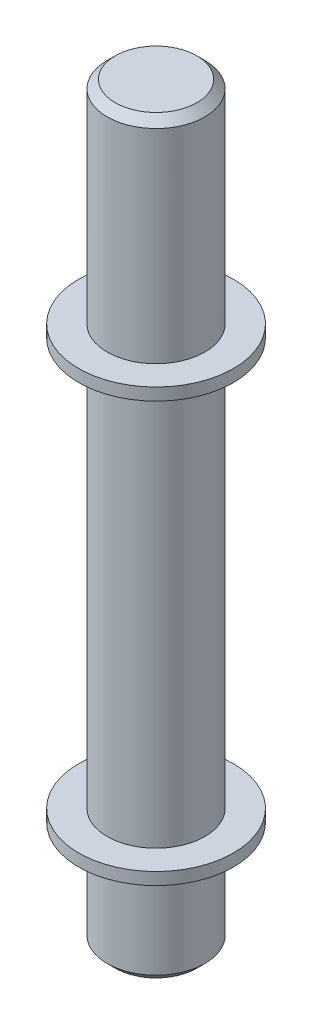
ISO-10303-21;
HEADER;
FILE_DESCRIPTION(('STEP AP214'),'2;1');
FILE_NAME('part.step','',(''),(''),'','','');
FILE_SCHEMA(('AUTOMOTIVE_DESIGN { 1 0 10303 214 1 1 1 1 }'));
ENDSEC;
DATA;
#1=APPLICATION_CONTEXT('core data for automotive mechanical design processes');
#2=APPLICATION_PROTOCOL_DEFINITION('international standard','automotive_design',2000,#1);
#3=PRODUCT_CONTEXT('',#1,'mechanical');
#4=PRODUCT('Part','Part','',(#3));
#5=PRODUCT_RELATED_PRODUCT_CATEGORY('part','',(#4));
#6=PRODUCT_DEFINITION_FORMATION('','',#4);
#7=PRODUCT_DEFINITION_CONTEXT('part definition',#1,'design');
#8=PRODUCT_DEFINITION('design','',#6,#7);
#9=PRODUCT_DEFINITION_SHAPE('','',#8);
#10=(LENGTH_UNIT() NAMED_UNIT(*) SI_UNIT(.MILLI.,.METRE.));
#11=(NAMED_UNIT(*) PLANE_ANGLE_UNIT() SI_UNIT($,.RADIAN.));
#12=(NAMED_UNIT(*) SI_UNIT($,.STERADIAN.) SOLID_ANGLE_UNIT());
#13=UNCERTAINTY_MEASURE_WITH_UNIT(LENGTH_MEASURE(1.E-05),#10,'distance_accuracy_value','');
#14=(GEOMETRIC_REPRESENTATION_CONTEXT(3) GLOBAL_UNCERTAINTY_ASSIGNED_CONTEXT((#13)) GLOBAL_UNIT_ASSIGNED_CONTEXT((#10,
#11,#12)) REPRESENTATION_CONTEXT('',''));
#15=CARTESIAN_POINT('',(0.,0.,0.));
#16=DIRECTION('',(0.,0.,1.));
#17=DIRECTION('',(1.,0.,0.));
#18=AXIS2_PLACEMENT_3D('',#15,#16,#17);
#19=CARTESIAN_POINT('',(0.,184.,0.));
#20=DIRECTION('',(0.,1.,0.));
#21=DIRECTION('',(0.,0.,1.));
#22=AXIS2_PLACEMENT_3D('',#19,#20,#21);
#23=PLANE('',#22);
#24=CARTESIAN_POINT('',(0.,184.,0.));
#25=DIRECTION('',(0.,1.,0.));
#26=DIRECTION('',(0.,0.,1.));
#27=AXIS2_PLACEMENT_3D('',#24,#25,#26);
#28=CIRCLE('',#27,10.);
#29=CARTESIAN_POINT('',(0.,184.,10.));
#30=VERTEX_POINT('',#29);
#31=EDGE_CURVE('E10',#30,#30,#28,.T.);
#32=ORIENTED_EDGE('',*,*,#31,.T.);
#33=EDGE_LOOP('',(#32));
#34=FACE_BOUND('',#33,.T.);
#35=ADVANCED_FACE('F47',(#34),#23,.T.);
#36=CARTESIAN_POINT('',(0.,0.,0.));
#37=DIRECTION('',(0.,-1.,0.));
#38=DIRECTION('',(0.,0.,-1.));
#39=AXIS2_PLACEMENT_3D('',#36,#37,#38);
#40=CYLINDRICAL_SURFACE('',#39,12.);
#41=CARTESIAN_POINT('',(0.,182.,0.));
#42=DIRECTION('',(0.,1.,0.));
#43=DIRECTION('',(0.,0.,1.));
#44=AXIS2_PLACEMENT_3D('',#41,#42,#43);
#45=CIRCLE('',#44,12.);
#46=CARTESIAN_POINT('',(0.,182.,12.));
#47=VERTEX_POINT('',#46);
#48=EDGE_CURVE('E55',#47,#47,#45,.F.);
#49=ORIENTED_EDGE('',*,*,#48,.T.);
#50=EDGE_LOOP('',(#49));
#51=FACE_BOUND('',#50,.T.);
#52=CARTESIAN_POINT('',(0.,132.,0.));
#53=DIRECTION('',(0.,-1.,0.));
#54=DIRECTION('',(0.,0.,-1.));
#55=AXIS2_PLACEMENT_3D('',#52,#53,#54);
#56=CIRCLE('',#55,12.);
#57=CARTESIAN_POINT('',(0.,132.,-12.));
#58=VERTEX_POINT('',#57);
#59=EDGE_CURVE('E68',#58,#58,#56,.T.);
#60=ORIENTED_EDGE('',*,*,#59,.F.);
#61=EDGE_LOOP('',(#60));
#62=FACE_BOUND('',#61,.T.);
#63=ADVANCED_FACE('F111',(#51,#62),#40,.T.);
#64=CARTESIAN_POINT('',(12.,132.,0.));
#65=DIRECTION('',(0.,1.,0.));
#66=DIRECTION('',(0.,0.,1.));
#67=AXIS2_PLACEMENT_3D('',#64,#65,#66);
#68=PLANE('',#67);
#69=ORIENTED_EDGE('',*,*,#59,.T.);
#70=EDGE_LOOP('',(#69));
#71=FACE_BOUND('',#70,.T.);
#72=CARTESIAN_POINT('',(0.,132.,0.));
#73=DIRECTION('',(0.,-1.,0.));
#74=DIRECTION('',(0.,0.,-1.));
#75=AXIS2_PLACEMENT_3D('',#72,#73,#74);
#76=CIRCLE('',#75,19.);
#77=CARTESIAN_POINT('',(0.,132.,-19.));
#78=VERTEX_POINT('',#77);
#79=EDGE_CURVE('E71',#78,#78,#76,.T.);
#80=ORIENTED_EDGE('',*,*,#79,.F.);
#81=EDGE_LOOP('',(#80));
#82=FACE_BOUND('',#81,.T.);
#83=ADVANCED_FACE('F116',(#71,#82),#68,.T.);
#84=CARTESIAN_POINT('',(0.,0.,0.));
#85=DIRECTION('',(0.,-1.,0.));
#86=DIRECTION('',(0.,0.,-1.));
#87=AXIS2_PLACEMENT_3D('',#84,#85,#86);
#88=CYLINDRICAL_SURFACE('',#87,19.);
#89=ORIENTED_EDGE('',*,*,#79,.T.);
#90=EDGE_LOOP('',(#89));
#91=FACE_BOUND('',#90,.T.);
#92=CARTESIAN_POINT('',(0.,129.,0.));
#93=DIRECTION('',(0.,-1.,0.));
#94=DIRECTION('',(0.,0.,-1.));
#95=AXIS2_PLACEMENT_3D('',#92,#93,#94);
#96=CIRCLE('',#95,19.);
#97=CARTESIAN_POINT('',(0.,129.,-19.));
#98=VERTEX_POINT('',#97);
#99=EDGE_CURVE('E74',#98,#98,#96,.T.);
#100=ORIENTED_EDGE('',*,*,#99,.F.);
#101=EDGE_LOOP('',(#100));
#102=FACE_BOUND('',#101,.T.);
#103=ADVANCED_FACE('F159',(#91,#102),#88,.T.);
#104=CARTESIAN_POINT('',(12.,129.,0.));
#105=DIRECTION('',(0.,-1.,0.));
#106=DIRECTION('',(0.,0.,-1.));
#107=AXIS2_PLACEMENT_3D('',#104,#105,#106);
#108=PLANE('',#107);
#109=ORIENTED_EDGE('',*,*,#99,.T.);
#110=EDGE_LOOP('',(#109));
#111=FACE_BOUND('',#110,.T.);
#112=CARTESIAN_POINT('',(0.,129.,0.));
#113=DIRECTION('',(0.,-1.,0.));
#114=DIRECTION('',(0.,0.,-1.));
#115=AXIS2_PLACEMENT_3D('',#112,#113,#114);
#116=CIRCLE('',#115,12.);
#117=CARTESIAN_POINT('',(0.,129.,-12.));
#118=VERTEX_POINT('',#117);
#119=EDGE_CURVE('E77',#118,#118,#116,.T.);
#120=ORIENTED_EDGE('',*,*,#119,.F.);
#121=EDGE_LOOP('',(#120));
#122=FACE_BOUND('',#121,.T.);
#123=ADVANCED_FACE('F166',(#111,#122),#108,.T.);
#124=CARTESIAN_POINT('',(0.,0.,0.));
#125=DIRECTION('',(0.,-1.,0.));
#126=DIRECTION('',(0.,0.,-1.));
#127=AXIS2_PLACEMENT_3D('',#124,#125,#126);
#128=CYLINDRICAL_SURFACE('',#127,12.);
#129=ORIENTED_EDGE('',*,*,#119,.T.);
#130=EDGE_LOOP('',(#129));
#131=FACE_BOUND('',#130,.T.);
#132=CARTESIAN_POINT('',(0.,29.,0.));
#133=DIRECTION('',(0.,-1.,0.));
#134=DIRECTION('',(0.,0.,-1.));
#135=AXIS2_PLACEMENT_3D('',#132,#133,#134);
#136=CIRCLE('',#135,12.);
#137=CARTESIAN_POINT('',(0.,29.,-12.));
#138=VERTEX_POINT('',#137);
#139=EDGE_CURVE('E80',#138,#138,#136,.T.);
#140=ORIENTED_EDGE('',*,*,#139,.F.);
#141=EDGE_LOOP('',(#140));
#142=FACE_BOUND('',#141,.T.);
#143=ADVANCED_FACE('F174',(#131,#142),#128,.T.);
#144=CARTESIAN_POINT('',(12.,29.,0.));
#145=DIRECTION('',(0.,1.,0.));
#146=DIRECTION('',(0.,0.,1.));
#147=AXIS2_PLACEMENT_3D('',#144,#145,#146);
#148=PLANE('',#147);
#149=ORIENTED_EDGE('',*,*,#139,.T.);
#150=EDGE_LOOP('',(#149));
#151=FACE_BOUND('',#150,.T.);
#152=CARTESIAN_POINT('',(0.,29.,0.));
#153=DIRECTION('',(0.,-1.,0.));
#154=DIRECTION('',(0.,0.,-1.));
#155=AXIS2_PLACEMENT_3D('',#152,#153,#154);
#156=CIRCLE('',#155,19.);
#157=CARTESIAN_POINT('',(0.,29.,-19.));
#158=VERTEX_POINT('',#157);
#159=EDGE_CURVE('E83',#158,#158,#156,.T.);
#160=ORIENTED_EDGE('',*,*,#159,.F.);
#161=EDGE_LOOP('',(#160));
#162=FACE_BOUND('',#161,.T.);
#163=ADVANCED_FACE('F107',(#151,#162),#148,.T.);
#164=CARTESIAN_POINT('',(0.,0.,0.));
#165=DIRECTION('',(0.,-1.,0.));
#166=DIRECTION('',(0.,0.,-1.));
#167=AXIS2_PLACEMENT_3D('',#164,#165,#166);
#168=CYLINDRICAL_SURFACE('',#167,19.);
#169=ORIENTED_EDGE('',*,*,#159,.T.);
#170=EDGE_LOOP('',(#169));
#171=FACE_BOUND('',#170,.T.);
#172=CARTESIAN_POINT('',(0.,26.,0.));
#173=DIRECTION('',(0.,-1.,0.));
#174=DIRECTION('',(0.,0.,-1.));
#175=AXIS2_PLACEMENT_3D('',#172,#173,#174);
#176=CIRCLE('',#175,19.);
#177=CARTESIAN_POINT('',(0.,26.,-19.));
#178=VERTEX_POINT('',#177);
#179=EDGE_CURVE('E86',#178,#178,#176,.T.);
#180=ORIENTED_EDGE('',*,*,#179,.F.);
#181=EDGE_LOOP('',(#180));
#182=FACE_BOUND('',#181,.T.);
#183=ADVANCED_FACE('F97',(#171,#182),#168,.T.);
#184=CARTESIAN_POINT('',(12.,26.,0.));
#185=DIRECTION('',(0.,-1.,0.));
#186=DIRECTION('',(0.,0.,-1.));
#187=AXIS2_PLACEMENT_3D('',#184,#185,#186);
#188=PLANE('',#187);
#189=ORIENTED_EDGE('',*,*,#179,.T.);
#190=EDGE_LOOP('',(#189));
#191=FACE_BOUND('',#190,.T.);
#192=CARTESIAN_POINT('',(0.,26.,0.));
#193=DIRECTION('',(0.,-1.,0.));
#194=DIRECTION('',(0.,0.,-1.));
#195=AXIS2_PLACEMENT_3D('',#192,#193,#194);
#196=CIRCLE('',#195,12.);
#197=CARTESIAN_POINT('',(0.,26.,-12.));
#198=VERTEX_POINT('',#197);
#199=EDGE_CURVE('E89',#198,#198,#196,.T.);
#200=ORIENTED_EDGE('',*,*,#199,.F.);
#201=EDGE_LOOP('',(#200));
#202=FACE_BOUND('',#201,.T.);
#203=ADVANCED_FACE('F95',(#191,#202),#188,.T.);
#204=CARTESIAN_POINT('',(0.,0.,0.));
#205=DIRECTION('',(0.,-1.,0.));
#206=DIRECTION('',(0.,0.,-1.));
#207=AXIS2_PLACEMENT_3D('',#204,#205,#206);
#208=CYLINDRICAL_SURFACE('',#207,12.);
#209=CARTESIAN_POINT('',(0.,2.00000000000001,0.));
#210=DIRECTION('',(0.,-1.,0.));
#211=DIRECTION('',(0.,0.,-1.));
#212=AXIS2_PLACEMENT_3D('',#209,#210,#211);
#213=CIRCLE('',#212,12.);
#214=CARTESIAN_POINT('',(0.,2.00000000000001,-12.));
#215=VERTEX_POINT('',#214);
#216=EDGE_CURVE('E59',#215,#215,#213,.F.);
#217=ORIENTED_EDGE('',*,*,#216,.T.);
#218=EDGE_LOOP('',(#217));
#219=FACE_BOUND('',#218,.T.);
#220=ORIENTED_EDGE('',*,*,#199,.T.);
#221=EDGE_LOOP('',(#220));
#222=FACE_BOUND('',#221,.T.);
#223=ADVANCED_FACE('F93',(#219,#222),#208,.T.);
#224=CARTESIAN_POINT('',(0.,0.,0.));
#225=DIRECTION('',(0.,-1.,0.));
#226=DIRECTION('',(0.,0.,-1.));
#227=AXIS2_PLACEMENT_3D('',#224,#225,#226);
#228=PLANE('',#227);
#229=CARTESIAN_POINT('',(0.,0.,0.));
#230=DIRECTION('',(0.,-1.,0.));
#231=DIRECTION('',(0.,0.,-1.));
#232=AXIS2_PLACEMENT_3D('',#229,#230,#231);
#233=CIRCLE('',#232,9.99999999999998);
#234=CARTESIAN_POINT('',(0.,0.,-9.99999999999998));
#235=VERTEX_POINT('',#234);
#236=EDGE_CURVE('E63',#235,#235,#233,.T.);
#237=ORIENTED_EDGE('',*,*,#236,.T.);
#238=EDGE_LOOP('',(#237));
#239=FACE_BOUND('',#238,.T.);
#240=ADVANCED_FACE('F104',(#239),#228,.T.);
#241=CARTESIAN_POINT('',(0.,0.,0.));
#242=DIRECTION('',(0.,1.,0.));
#243=DIRECTION('',(0.,0.,1.));
#244=AXIS2_PLACEMENT_3D('',#241,#242,#243);
#245=CONICAL_SURFACE('',#244,9.99999999999998,0.785398163397452);
#246=ORIENTED_EDGE('',*,*,#216,.F.);
#247=EDGE_LOOP('',(#246));
#248=FACE_BOUND('',#247,.T.);
#249=ORIENTED_EDGE('',*,*,#236,.F.);
#250=EDGE_LOOP('',(#249));
#251=FACE_BOUND('',#250,.T.);
#252=ADVANCED_FACE('F120',(#248,#251),#245,.T.);
#253=CARTESIAN_POINT('',(0.,182.,0.));
#254=DIRECTION('',(0.,-1.,0.));
#255=DIRECTION('',(0.,0.,-1.));
#256=AXIS2_PLACEMENT_3D('',#253,#254,#255);
#257=CONICAL_SURFACE('',#256,12.,0.785398163397446);
#258=ORIENTED_EDGE('',*,*,#31,.F.);
#259=EDGE_LOOP('',(#258));
#260=FACE_BOUND('',#259,.T.);
#261=ORIENTED_EDGE('',*,*,#48,.F.);
#262=EDGE_LOOP('',(#261));
#263=FACE_BOUND('',#262,.T.);
#264=ADVANCED_FACE('F50',(#260,#263),#257,.T.);
#265=CLOSED_SHELL('',(#35,#63,#83,#103,#123,#143,#163,#183,#203,#223,#240,#252,#264));
#266=MANIFOLD_SOLID_BREP('B2',#265);
#267=ADVANCED_BREP_SHAPE_REPRESENTATION('',(#18,#266),#14);
#268=SHAPE_DEFINITION_REPRESENTATION(#9,#267);
ENDSEC;
END-ISO-10303-21;
